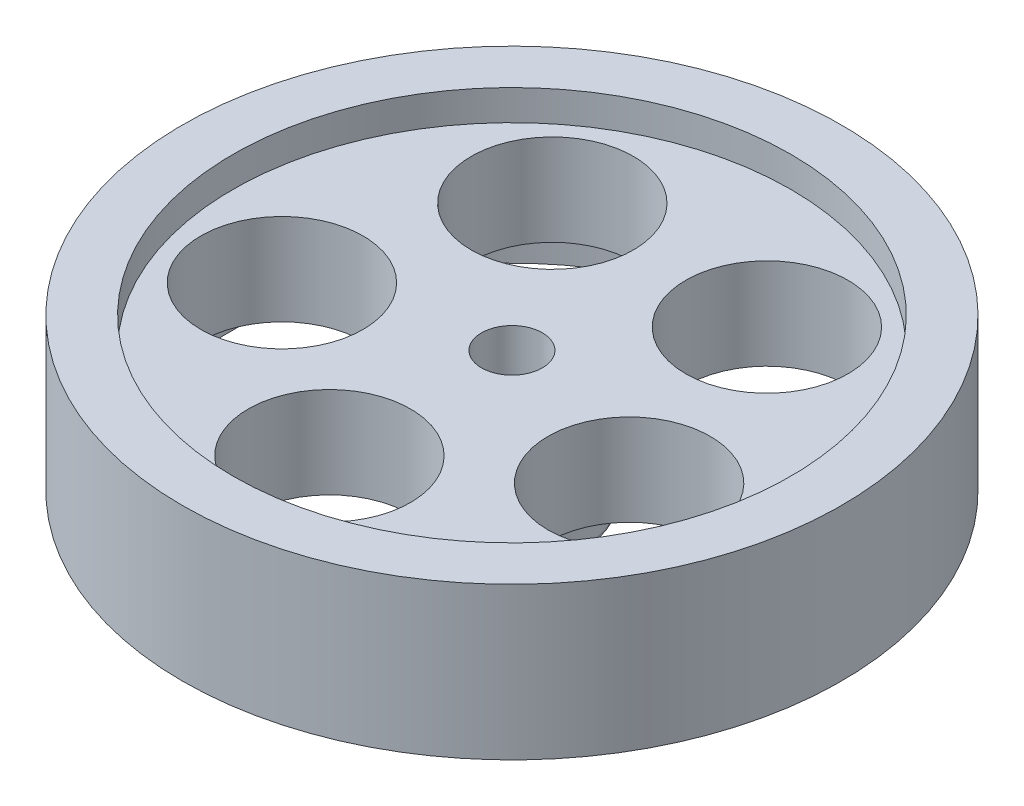
ISO-10303-21;
HEADER;
FILE_DESCRIPTION(('STEP AP214'),'2;1');
FILE_NAME('part.step','',(''),(''),'','','');
FILE_SCHEMA(('AUTOMOTIVE_DESIGN { 1 0 10303 214 1 1 1 1 }'));
ENDSEC;
DATA;
#1=APPLICATION_CONTEXT('core data for automotive mechanical design processes');
#2=APPLICATION_PROTOCOL_DEFINITION('international standard','automotive_design',2000,#1);
#3=PRODUCT_CONTEXT('',#1,'mechanical');
#4=PRODUCT('Part','Part','',(#3));
#5=PRODUCT_RELATED_PRODUCT_CATEGORY('part','',(#4));
#6=PRODUCT_DEFINITION_FORMATION('','',#4);
#7=PRODUCT_DEFINITION_CONTEXT('part definition',#1,'design');
#8=PRODUCT_DEFINITION('design','',#6,#7);
#9=PRODUCT_DEFINITION_SHAPE('','',#8);
#10=(LENGTH_UNIT() NAMED_UNIT(*) SI_UNIT(.MILLI.,.METRE.));
#11=(NAMED_UNIT(*) PLANE_ANGLE_UNIT() SI_UNIT($,.RADIAN.));
#12=(NAMED_UNIT(*) SI_UNIT($,.STERADIAN.) SOLID_ANGLE_UNIT());
#13=UNCERTAINTY_MEASURE_WITH_UNIT(LENGTH_MEASURE(1.E-05),#10,'distance_accuracy_value','');
#14=(GEOMETRIC_REPRESENTATION_CONTEXT(3) GLOBAL_UNCERTAINTY_ASSIGNED_CONTEXT((#13)) GLOBAL_UNIT_ASSIGNED_CONTEXT((#10,
#11,#12)) REPRESENTATION_CONTEXT('',''));
#15=CARTESIAN_POINT('',(0.,0.,0.));
#16=DIRECTION('',(0.,0.,1.));
#17=DIRECTION('',(1.,0.,0.));
#18=AXIS2_PLACEMENT_3D('',#15,#16,#17);
#19=CARTESIAN_POINT('',(0.,15.,0.));
#20=DIRECTION('',(0.,-1.,0.));
#21=DIRECTION('',(0.,0.,-1.));
#22=AXIS2_PLACEMENT_3D('',#19,#20,#21);
#23=CYLINDRICAL_SURFACE('',#22,32.5);
#24=CARTESIAN_POINT('',(0.,15.,0.));
#25=DIRECTION('',(0.,1.,0.));
#26=DIRECTION('',(0.,0.,1.));
#27=AXIS2_PLACEMENT_3D('',#24,#25,#26);
#28=CIRCLE('',#27,32.5);
#29=CARTESIAN_POINT('',(0.,15.,32.5));
#30=VERTEX_POINT('',#29);
#31=EDGE_CURVE('E54',#30,#30,#28,.T.);
#32=ORIENTED_EDGE('',*,*,#31,.F.);
#33=EDGE_LOOP('',(#32));
#34=FACE_BOUND('',#33,.T.);
#35=CARTESIAN_POINT('',(0.,0.,0.));
#36=DIRECTION('',(0.,1.,0.));
#37=DIRECTION('',(0.,0.,1.));
#38=AXIS2_PLACEMENT_3D('',#35,#36,#37);
#39=CIRCLE('',#38,32.5);
#40=CARTESIAN_POINT('',(0.,0.,32.5));
#41=VERTEX_POINT('',#40);
#42=EDGE_CURVE('E76',#41,#41,#39,.T.);
#43=ORIENTED_EDGE('',*,*,#42,.T.);
#44=EDGE_LOOP('',(#43));
#45=FACE_BOUND('',#44,.T.);
#46=ADVANCED_FACE('F37',(#34,#45),#23,.T.);
#47=CARTESIAN_POINT('',(0.,15.,0.));
#48=DIRECTION('',(0.,1.,0.));
#49=DIRECTION('',(0.,0.,1.));
#50=AXIS2_PLACEMENT_3D('',#47,#48,#49);
#51=PLANE('',#50);
#52=CARTESIAN_POINT('',(0.,15.,0.));
#53=DIRECTION('',(0.,1.,0.));
#54=DIRECTION('',(0.,0.,1.));
#55=AXIS2_PLACEMENT_3D('',#52,#53,#54);
#56=CIRCLE('',#55,27.5);
#57=CARTESIAN_POINT('',(0.,15.,27.5));
#58=VERTEX_POINT('',#57);
#59=EDGE_CURVE('E82',#58,#58,#56,.T.);
#60=ORIENTED_EDGE('',*,*,#59,.F.);
#61=EDGE_LOOP('',(#60));
#62=FACE_BOUND('',#61,.T.);
#63=ORIENTED_EDGE('',*,*,#31,.T.);
#64=EDGE_LOOP('',(#63));
#65=FACE_BOUND('',#64,.T.);
#66=ADVANCED_FACE('F125',(#62,#65),#51,.T.);
#67=CARTESIAN_POINT('',(0.,0.,0.));
#68=DIRECTION('',(0.,1.,0.));
#69=DIRECTION('',(0.,0.,1.));
#70=AXIS2_PLACEMENT_3D('',#67,#68,#69);
#71=PLANE('',#70);
#72=CARTESIAN_POINT('',(0.,0.,0.));
#73=DIRECTION('',(0.,1.,0.));
#74=DIRECTION('',(0.,0.,1.));
#75=AXIS2_PLACEMENT_3D('',#72,#73,#74);
#76=CIRCLE('',#75,27.5);
#77=CARTESIAN_POINT('',(0.,0.,27.5));
#78=VERTEX_POINT('',#77);
#79=EDGE_CURVE('E88',#78,#78,#76,.T.);
#80=ORIENTED_EDGE('',*,*,#79,.T.);
#81=EDGE_LOOP('',(#80));
#82=FACE_BOUND('',#81,.T.);
#83=ORIENTED_EDGE('',*,*,#42,.F.);
#84=EDGE_LOOP('',(#83));
#85=FACE_BOUND('',#84,.T.);
#86=ADVANCED_FACE('F130',(#82,#85),#71,.F.);
#87=CARTESIAN_POINT('',(0.,12.,0.));
#88=DIRECTION('',(0.,1.,0.));
#89=DIRECTION('',(0.,0.,1.));
#90=AXIS2_PLACEMENT_3D('',#87,#88,#89);
#91=CYLINDRICAL_SURFACE('',#90,27.5);
#92=CARTESIAN_POINT('',(0.,12.,0.));
#93=DIRECTION('',(0.,1.,0.));
#94=DIRECTION('',(0.,0.,1.));
#95=AXIS2_PLACEMENT_3D('',#92,#93,#94);
#96=CIRCLE('',#95,27.5);
#97=CARTESIAN_POINT('',(0.,12.,27.5));
#98=VERTEX_POINT('',#97);
#99=EDGE_CURVE('E79',#98,#98,#96,.T.);
#100=ORIENTED_EDGE('',*,*,#99,.F.);
#101=EDGE_LOOP('',(#100));
#102=FACE_BOUND('',#101,.T.);
#103=ORIENTED_EDGE('',*,*,#59,.T.);
#104=EDGE_LOOP('',(#103));
#105=FACE_BOUND('',#104,.T.);
#106=ADVANCED_FACE('F137',(#102,#105),#91,.F.);
#107=CARTESIAN_POINT('',(0.,12.,0.));
#108=DIRECTION('',(0.,1.,0.));
#109=DIRECTION('',(0.,0.,1.));
#110=AXIS2_PLACEMENT_3D('',#107,#108,#109);
#111=PLANE('',#110);
#112=CARTESIAN_POINT('',(0.,12.,0.));
#113=DIRECTION('',(0.,1.,0.));
#114=DIRECTION('',(0.,0.,1.));
#115=AXIS2_PLACEMENT_3D('',#112,#113,#114);
#116=CIRCLE('',#115,3.);
#117=CARTESIAN_POINT('',(0.,12.,3.));
#118=VERTEX_POINT('',#117);
#119=EDGE_CURVE('E75',#118,#118,#116,.T.);
#120=ORIENTED_EDGE('',*,*,#119,.F.);
#121=EDGE_LOOP('',(#120));
#122=FACE_BOUND('',#121,.T.);
#123=CARTESIAN_POINT('',(-17.1190172933127,12.,5.56230589874925));
#124=DIRECTION('',(0.,1.,0.));
#125=DIRECTION('',(0.,0.,1.));
#126=AXIS2_PLACEMENT_3D('',#123,#124,#125);
#127=CIRCLE('',#126,8.);
#128=CARTESIAN_POINT('',(-17.1190172933127,12.,13.5623058987492));
#129=VERTEX_POINT('',#128);
#130=EDGE_CURVE('E58',#129,#129,#127,.T.);
#131=ORIENTED_EDGE('',*,*,#130,.F.);
#132=EDGE_LOOP('',(#131));
#133=FACE_BOUND('',#132,.T.);
#134=CARTESIAN_POINT('',(-10.5801345412641,12.,-14.5623058987492));
#135=DIRECTION('',(0.,1.,0.));
#136=DIRECTION('',(0.,0.,1.));
#137=AXIS2_PLACEMENT_3D('',#134,#135,#136);
#138=CIRCLE('',#137,8.00000000000063);
#139=CARTESIAN_POINT('',(-10.5801345412641,12.,-6.56230589874857));
#140=VERTEX_POINT('',#139);
#141=EDGE_CURVE('E59',#140,#140,#138,.T.);
#142=ORIENTED_EDGE('',*,*,#141,.F.);
#143=EDGE_LOOP('',(#142));
#144=FACE_BOUND('',#143,.T.);
#145=CARTESIAN_POINT('',(10.5801345412644,12.,-14.5623058987491));
#146=DIRECTION('',(0.,1.,0.));
#147=DIRECTION('',(0.,0.,1.));
#148=AXIS2_PLACEMENT_3D('',#145,#146,#147);
#149=CIRCLE('',#148,8.);
#150=CARTESIAN_POINT('',(10.5801345412644,12.,-6.56230589874911));
#151=VERTEX_POINT('',#150);
#152=EDGE_CURVE('E63',#151,#151,#149,.T.);
#153=ORIENTED_EDGE('',*,*,#152,.F.);
#154=EDGE_LOOP('',(#153));
#155=FACE_BOUND('',#154,.T.);
#156=CARTESIAN_POINT('',(17.1190172933128,12.,5.56230589874901));
#157=DIRECTION('',(0.,1.,0.));
#158=DIRECTION('',(0.,0.,1.));
#159=AXIS2_PLACEMENT_3D('',#156,#157,#158);
#160=CIRCLE('',#159,8.);
#161=CARTESIAN_POINT('',(17.1190172933128,12.,13.562305898749));
#162=VERTEX_POINT('',#161);
#163=EDGE_CURVE('E67',#162,#162,#160,.T.);
#164=ORIENTED_EDGE('',*,*,#163,.F.);
#165=EDGE_LOOP('',(#164));
#166=FACE_BOUND('',#165,.T.);
#167=CARTESIAN_POINT('',(0.,12.,18.));
#168=DIRECTION('',(0.,1.,0.));
#169=DIRECTION('',(0.,0.,1.));
#170=AXIS2_PLACEMENT_3D('',#167,#168,#169);
#171=CIRCLE('',#170,8.);
#172=CARTESIAN_POINT('',(0.,12.,26.));
#173=VERTEX_POINT('',#172);
#174=EDGE_CURVE('E71',#173,#173,#171,.T.);
#175=ORIENTED_EDGE('',*,*,#174,.F.);
#176=EDGE_LOOP('',(#175));
#177=FACE_BOUND('',#176,.T.);
#178=ORIENTED_EDGE('',*,*,#99,.T.);
#179=EDGE_LOOP('',(#178));
#180=FACE_BOUND('',#179,.T.);
#181=ADVANCED_FACE('F142',(#122,#133,#144,#155,#166,#177,#180),#111,.T.);
#182=CARTESIAN_POINT('',(0.,2.99999999999999,0.));
#183=DIRECTION('',(0.,-1.,0.));
#184=DIRECTION('',(0.,0.,-1.));
#185=AXIS2_PLACEMENT_3D('',#182,#183,#184);
#186=CYLINDRICAL_SURFACE('',#185,27.5);
#187=CARTESIAN_POINT('',(0.,2.99999999999999,0.));
#188=DIRECTION('',(0.,1.,0.));
#189=DIRECTION('',(0.,0.,1.));
#190=AXIS2_PLACEMENT_3D('',#187,#188,#189);
#191=CIRCLE('',#190,27.5);
#192=CARTESIAN_POINT('',(0.,2.99999999999999,27.5));
#193=VERTEX_POINT('',#192);
#194=EDGE_CURVE('E85',#193,#193,#191,.T.);
#195=ORIENTED_EDGE('',*,*,#194,.T.);
#196=EDGE_LOOP('',(#195));
#197=FACE_BOUND('',#196,.T.);
#198=ORIENTED_EDGE('',*,*,#79,.F.);
#199=EDGE_LOOP('',(#198));
#200=FACE_BOUND('',#199,.T.);
#201=ADVANCED_FACE('F146',(#197,#200),#186,.F.);
#202=CARTESIAN_POINT('',(0.,2.99999999999999,0.));
#203=DIRECTION('',(0.,1.,0.));
#204=DIRECTION('',(0.,0.,1.));
#205=AXIS2_PLACEMENT_3D('',#202,#203,#204);
#206=PLANE('',#205);
#207=CARTESIAN_POINT('',(0.,2.99999999999999,0.));
#208=DIRECTION('',(0.,1.,0.));
#209=DIRECTION('',(0.,0.,1.));
#210=AXIS2_PLACEMENT_3D('',#207,#208,#209);
#211=CIRCLE('',#210,7.27340298797565);
#212=CARTESIAN_POINT('',(0.,2.99999999999999,7.27340298797565));
#213=VERTEX_POINT('',#212);
#214=EDGE_CURVE('E49',#213,#213,#211,.F.);
#215=ORIENTED_EDGE('',*,*,#214,.F.);
#216=EDGE_LOOP('',(#215));
#217=FACE_BOUND('',#216,.T.);
#218=CARTESIAN_POINT('',(-17.1190172933127,2.99999999999999,5.56230589874925));
#219=DIRECTION('',(0.,1.,0.));
#220=DIRECTION('',(0.,0.,1.));
#221=AXIS2_PLACEMENT_3D('',#218,#219,#220);
#222=CIRCLE('',#221,8.);
#223=CARTESIAN_POINT('',(-17.1190172933127,2.99999999999999,13.5623058987492));
#224=VERTEX_POINT('',#223);
#225=EDGE_CURVE('E55',#224,#224,#222,.T.);
#226=ORIENTED_EDGE('',*,*,#225,.T.);
#227=EDGE_LOOP('',(#226));
#228=FACE_BOUND('',#227,.T.);
#229=CARTESIAN_POINT('',(-10.5801345412641,2.99999999999999,-14.5623058987492));
#230=DIRECTION('',(0.,1.,0.));
#231=DIRECTION('',(0.,0.,1.));
#232=AXIS2_PLACEMENT_3D('',#229,#230,#231);
#233=CIRCLE('',#232,8.00000000000063);
#234=CARTESIAN_POINT('',(-10.5801345412641,2.99999999999999,-6.56230589874857));
#235=VERTEX_POINT('',#234);
#236=EDGE_CURVE('E60',#235,#235,#233,.T.);
#237=ORIENTED_EDGE('',*,*,#236,.T.);
#238=EDGE_LOOP('',(#237));
#239=FACE_BOUND('',#238,.T.);
#240=CARTESIAN_POINT('',(10.5801345412644,2.99999999999999,-14.5623058987491));
#241=DIRECTION('',(0.,1.,0.));
#242=DIRECTION('',(0.,0.,1.));
#243=AXIS2_PLACEMENT_3D('',#240,#241,#242);
#244=CIRCLE('',#243,8.);
#245=CARTESIAN_POINT('',(10.5801345412644,2.99999999999999,-6.56230589874911));
#246=VERTEX_POINT('',#245);
#247=EDGE_CURVE('E64',#246,#246,#244,.T.);
#248=ORIENTED_EDGE('',*,*,#247,.T.);
#249=EDGE_LOOP('',(#248));
#250=FACE_BOUND('',#249,.T.);
#251=CARTESIAN_POINT('',(17.1190172933128,2.99999999999999,5.56230589874901));
#252=DIRECTION('',(0.,1.,0.));
#253=DIRECTION('',(0.,0.,1.));
#254=AXIS2_PLACEMENT_3D('',#251,#252,#253);
#255=CIRCLE('',#254,8.);
#256=CARTESIAN_POINT('',(17.1190172933128,2.99999999999999,13.562305898749));
#257=VERTEX_POINT('',#256);
#258=EDGE_CURVE('E68',#257,#257,#255,.T.);
#259=ORIENTED_EDGE('',*,*,#258,.T.);
#260=EDGE_LOOP('',(#259));
#261=FACE_BOUND('',#260,.T.);
#262=CARTESIAN_POINT('',(0.,2.99999999999999,18.));
#263=DIRECTION('',(0.,1.,0.));
#264=DIRECTION('',(0.,0.,1.));
#265=AXIS2_PLACEMENT_3D('',#262,#263,#264);
#266=CIRCLE('',#265,8.);
#267=CARTESIAN_POINT('',(0.,2.99999999999999,26.));
#268=VERTEX_POINT('',#267);
#269=EDGE_CURVE('E72',#268,#268,#266,.T.);
#270=ORIENTED_EDGE('',*,*,#269,.T.);
#271=EDGE_LOOP('',(#270));
#272=FACE_BOUND('',#271,.T.);
#273=ORIENTED_EDGE('',*,*,#194,.F.);
#274=EDGE_LOOP('',(#273));
#275=FACE_BOUND('',#274,.T.);
#276=ADVANCED_FACE('F150',(#217,#228,#239,#250,#261,#272,#275),#206,.F.);
#277=CARTESIAN_POINT('',(0.,15.,18.));
#278=DIRECTION('',(0.,-1.,0.));
#279=DIRECTION('',(0.,0.,-1.));
#280=AXIS2_PLACEMENT_3D('',#277,#278,#279);
#281=CYLINDRICAL_SURFACE('',#280,8.);
#282=ORIENTED_EDGE('',*,*,#174,.T.);
#283=EDGE_LOOP('',(#282));
#284=FACE_BOUND('',#283,.T.);
#285=ORIENTED_EDGE('',*,*,#269,.F.);
#286=EDGE_LOOP('',(#285));
#287=FACE_BOUND('',#286,.T.);
#288=ADVANCED_FACE('F154',(#284,#287),#281,.F.);
#289=CARTESIAN_POINT('',(17.1190172933128,15.,5.56230589874901));
#290=DIRECTION('',(0.,-1.,0.));
#291=DIRECTION('',(0.,0.,-1.));
#292=AXIS2_PLACEMENT_3D('',#289,#290,#291);
#293=CYLINDRICAL_SURFACE('',#292,8.);
#294=ORIENTED_EDGE('',*,*,#163,.T.);
#295=EDGE_LOOP('',(#294));
#296=FACE_BOUND('',#295,.T.);
#297=ORIENTED_EDGE('',*,*,#258,.F.);
#298=EDGE_LOOP('',(#297));
#299=FACE_BOUND('',#298,.T.);
#300=ADVANCED_FACE('F158',(#296,#299),#293,.F.);
#301=CARTESIAN_POINT('',(10.5801345412644,15.,-14.5623058987491));
#302=DIRECTION('',(0.,-1.,0.));
#303=DIRECTION('',(0.,0.,-1.));
#304=AXIS2_PLACEMENT_3D('',#301,#302,#303);
#305=CYLINDRICAL_SURFACE('',#304,8.);
#306=ORIENTED_EDGE('',*,*,#152,.T.);
#307=EDGE_LOOP('',(#306));
#308=FACE_BOUND('',#307,.T.);
#309=ORIENTED_EDGE('',*,*,#247,.F.);
#310=EDGE_LOOP('',(#309));
#311=FACE_BOUND('',#310,.T.);
#312=ADVANCED_FACE('F167',(#308,#311),#305,.F.);
#313=CARTESIAN_POINT('',(-10.5801345412641,15.,-14.5623058987492));
#314=DIRECTION('',(0.,-1.,0.));
#315=DIRECTION('',(0.,0.,-1.));
#316=AXIS2_PLACEMENT_3D('',#313,#314,#315);
#317=CYLINDRICAL_SURFACE('',#316,8.00000000000063);
#318=ORIENTED_EDGE('',*,*,#141,.T.);
#319=EDGE_LOOP('',(#318));
#320=FACE_BOUND('',#319,.T.);
#321=ORIENTED_EDGE('',*,*,#236,.F.);
#322=EDGE_LOOP('',(#321));
#323=FACE_BOUND('',#322,.T.);
#324=ADVANCED_FACE('F163',(#320,#323),#317,.F.);
#325=CARTESIAN_POINT('',(-17.1190172933127,15.,5.56230589874925));
#326=DIRECTION('',(0.,-1.,0.));
#327=DIRECTION('',(0.,0.,-1.));
#328=AXIS2_PLACEMENT_3D('',#325,#326,#327);
#329=CYLINDRICAL_SURFACE('',#328,8.);
#330=ORIENTED_EDGE('',*,*,#130,.T.);
#331=EDGE_LOOP('',(#330));
#332=FACE_BOUND('',#331,.T.);
#333=ORIENTED_EDGE('',*,*,#225,.F.);
#334=EDGE_LOOP('',(#333));
#335=FACE_BOUND('',#334,.T.);
#336=ADVANCED_FACE('F160',(#332,#335),#329,.F.);
#337=CARTESIAN_POINT('',(0.,-1.50000000000001,0.));
#338=DIRECTION('',(0.,1.,0.));
#339=DIRECTION('',(0.,0.,1.));
#340=AXIS2_PLACEMENT_3D('',#337,#338,#339);
#341=CYLINDRICAL_SURFACE('',#340,7.27340298797565);
#342=CARTESIAN_POINT('',(0.,-1.00000000000001,0.));
#343=DIRECTION('',(0.,-1.,0.));
#344=DIRECTION('',(0.,0.,-1.));
#345=AXIS2_PLACEMENT_3D('',#342,#343,#344);
#346=CIRCLE('',#345,7.27340298797565);
#347=CARTESIAN_POINT('',(0.,-1.00000000000001,-7.27340298797565));
#348=VERTEX_POINT('',#347);
#349=EDGE_CURVE('E10',#348,#348,#346,.F.);
#350=ORIENTED_EDGE('',*,*,#349,.T.);
#351=EDGE_LOOP('',(#350));
#352=FACE_BOUND('',#351,.T.);
#353=ORIENTED_EDGE('',*,*,#214,.T.);
#354=EDGE_LOOP('',(#353));
#355=FACE_BOUND('',#354,.T.);
#356=ADVANCED_FACE('F114',(#352,#355),#341,.T.);
#357=CARTESIAN_POINT('',(0.,-1.50000000000001,0.));
#358=DIRECTION('',(0.,-1.,0.));
#359=DIRECTION('',(0.,0.,-1.));
#360=AXIS2_PLACEMENT_3D('',#357,#358,#359);
#361=PLANE('',#360);
#362=CARTESIAN_POINT('',(0.,-1.50000000000001,0.));
#363=DIRECTION('',(0.,-1.,0.));
#364=DIRECTION('',(0.,0.,-1.));
#365=AXIS2_PLACEMENT_3D('',#362,#363,#364);
#366=CIRCLE('',#365,3.);
#367=CARTESIAN_POINT('',(0.,-1.50000000000001,-3.));
#368=VERTEX_POINT('',#367);
#369=EDGE_CURVE('E41',#368,#368,#366,.T.);
#370=ORIENTED_EDGE('',*,*,#369,.F.);
#371=EDGE_LOOP('',(#370));
#372=FACE_BOUND('',#371,.T.);
#373=CARTESIAN_POINT('',(0.,-1.50000000000001,0.));
#374=DIRECTION('',(0.,-1.,0.));
#375=DIRECTION('',(0.,0.,-1.));
#376=AXIS2_PLACEMENT_3D('',#373,#374,#375);
#377=CIRCLE('',#376,6.77340298797565);
#378=CARTESIAN_POINT('',(0.,-1.50000000000001,-6.77340298797565));
#379=VERTEX_POINT('',#378);
#380=EDGE_CURVE('E45',#379,#379,#377,.T.);
#381=ORIENTED_EDGE('',*,*,#380,.T.);
#382=EDGE_LOOP('',(#381));
#383=FACE_BOUND('',#382,.T.);
#384=ADVANCED_FACE('F111',(#372,#383),#361,.T.);
#385=CARTESIAN_POINT('',(0.,-1.00000000000001,0.));
#386=DIRECTION('',(0.,-1.,0.));
#387=DIRECTION('',(0.,0.,-1.));
#388=AXIS2_PLACEMENT_3D('',#385,#386,#387);
#389=TOROIDAL_SURFACE('',#388,6.77340298797565,0.5);
#390=ORIENTED_EDGE('',*,*,#349,.F.);
#391=EDGE_LOOP('',(#390));
#392=FACE_BOUND('',#391,.T.);
#393=ORIENTED_EDGE('',*,*,#380,.F.);
#394=EDGE_LOOP('',(#393));
#395=FACE_BOUND('',#394,.T.);
#396=ADVANCED_FACE('F39',(#392,#395),#389,.T.);
#397=CARTESIAN_POINT('',(0.,15.,0.));
#398=DIRECTION('',(0.,-1.,0.));
#399=DIRECTION('',(0.,0.,-1.));
#400=AXIS2_PLACEMENT_3D('',#397,#398,#399);
#401=CYLINDRICAL_SURFACE('',#400,3.);
#402=ORIENTED_EDGE('',*,*,#119,.T.);
#403=EDGE_LOOP('',(#402));
#404=FACE_BOUND('',#403,.T.);
#405=ORIENTED_EDGE('',*,*,#369,.T.);
#406=EDGE_LOOP('',(#405));
#407=FACE_BOUND('',#406,.T.);
#408=ADVANCED_FACE('F109',(#404,#407),#401,.F.);
#409=CLOSED_SHELL('',(#46,#66,#86,#106,#181,#201,#276,#288,#300,#312,#324,#336,#356,#384,#396,#408));
#410=MANIFOLD_SOLID_BREP('B2',#409);
#411=ADVANCED_BREP_SHAPE_REPRESENTATION('',(#18,#410),#14);
#412=SHAPE_DEFINITION_REPRESENTATION(#9,#411);
ENDSEC;
END-ISO-10303-21;
